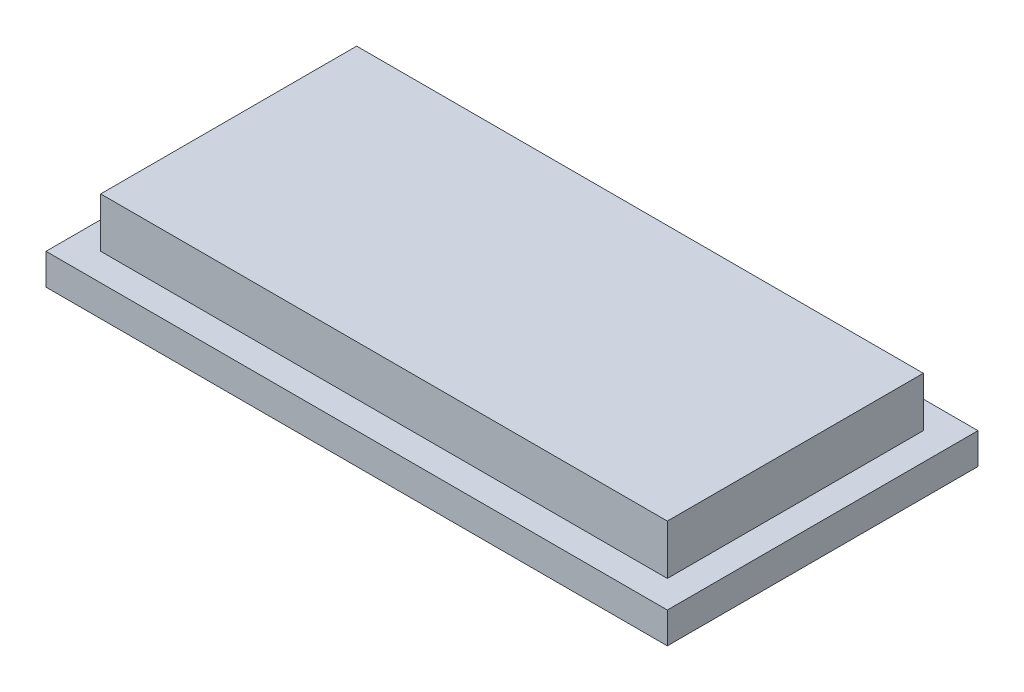
ISO-10303-21;
HEADER;
FILE_DESCRIPTION(('STEP AP214'),'2;1');
FILE_NAME('part.step','',(''),(''),'','','');
FILE_SCHEMA(('AUTOMOTIVE_DESIGN { 1 0 10303 214 1 1 1 1 }'));
ENDSEC;
DATA;
#1=APPLICATION_CONTEXT('core data for automotive mechanical design processes');
#2=APPLICATION_PROTOCOL_DEFINITION('international standard','automotive_design',2000,#1);
#3=PRODUCT_CONTEXT('',#1,'mechanical');
#4=PRODUCT('Part','Part','',(#3));
#5=PRODUCT_RELATED_PRODUCT_CATEGORY('part','',(#4));
#6=PRODUCT_DEFINITION_FORMATION('','',#4);
#7=PRODUCT_DEFINITION_CONTEXT('part definition',#1,'design');
#8=PRODUCT_DEFINITION('design','',#6,#7);
#9=PRODUCT_DEFINITION_SHAPE('','',#8);
#10=(LENGTH_UNIT() NAMED_UNIT(*) SI_UNIT(.MILLI.,.METRE.));
#11=(NAMED_UNIT(*) PLANE_ANGLE_UNIT() SI_UNIT($,.RADIAN.));
#12=(NAMED_UNIT(*) SI_UNIT($,.STERADIAN.) SOLID_ANGLE_UNIT());
#13=UNCERTAINTY_MEASURE_WITH_UNIT(LENGTH_MEASURE(1.E-05),#10,'distance_accuracy_value','');
#14=(GEOMETRIC_REPRESENTATION_CONTEXT(3) GLOBAL_UNCERTAINTY_ASSIGNED_CONTEXT((#13)) GLOBAL_UNIT_ASSIGNED_CONTEXT((#10,
#11,#12)) REPRESENTATION_CONTEXT('',''));
#15=CARTESIAN_POINT('',(0.,0.,0.));
#16=DIRECTION('',(0.,0.,1.));
#17=DIRECTION('',(1.,0.,0.));
#18=AXIS2_PLACEMENT_3D('',#15,#16,#17);
#19=CARTESIAN_POINT('',(0.,2.5,0.));
#20=DIRECTION('',(0.,-1.,0.));
#21=DIRECTION('',(0.,0.,-1.));
#22=AXIS2_PLACEMENT_3D('',#19,#20,#21);
#23=PLANE('',#22);
#24=DIRECTION('',(0.,0.,1.));
#25=VECTOR('',#24,1.);
#26=CARTESIAN_POINT('',(0.,2.5,0.));
#27=LINE('',#26,#25);
#28=CARTESIAN_POINT('',(0.,2.5,-25.));
#29=VERTEX_POINT('',#28);
#30=CARTESIAN_POINT('',(0.,2.5,0.));
#31=VERTEX_POINT('',#30);
#32=EDGE_CURVE('E127',#29,#31,#27,.T.);
#33=ORIENTED_EDGE('',*,*,#32,.T.);
#34=DIRECTION('',(1.,0.,0.));
#35=VECTOR('',#34,1.);
#36=CARTESIAN_POINT('',(0.,2.5,0.));
#37=LINE('',#36,#35);
#38=CARTESIAN_POINT('',(50.,2.5,0.));
#39=VERTEX_POINT('',#38);
#40=EDGE_CURVE('E130',#31,#39,#37,.T.);
#41=ORIENTED_EDGE('',*,*,#40,.T.);
#42=DIRECTION('',(0.,0.,-1.));
#43=VECTOR('',#42,1.);
#44=CARTESIAN_POINT('',(50.,2.5,0.));
#45=LINE('',#44,#43);
#46=CARTESIAN_POINT('',(50.,2.5,-25.));
#47=VERTEX_POINT('',#46);
#48=EDGE_CURVE('E133',#39,#47,#45,.T.);
#49=ORIENTED_EDGE('',*,*,#48,.T.);
#50=DIRECTION('',(-1.,0.,0.));
#51=VECTOR('',#50,1.);
#52=CARTESIAN_POINT('',(0.,2.5,-25.));
#53=LINE('',#52,#51);
#54=EDGE_CURVE('E135',#47,#29,#53,.T.);
#55=ORIENTED_EDGE('',*,*,#54,.T.);
#56=EDGE_LOOP('',(#33,#41,#49,#55));
#57=FACE_BOUND('',#56,.T.);
#58=DIRECTION('',(0.,0.,1.));
#59=VECTOR('',#58,1.);
#60=CARTESIAN_POINT('',(2.19999999999999,2.5,-2.2));
#61=LINE('',#60,#59);
#62=CARTESIAN_POINT('',(2.19999999999999,2.5,-22.8));
#63=VERTEX_POINT('',#62);
#64=CARTESIAN_POINT('',(2.19999999999999,2.5,-2.2));
#65=VERTEX_POINT('',#64);
#66=EDGE_CURVE('E48',#63,#65,#61,.T.);
#67=ORIENTED_EDGE('',*,*,#66,.F.);
#68=DIRECTION('',(-1.,0.,0.));
#69=VECTOR('',#68,1.);
#70=CARTESIAN_POINT('',(2.19999999999999,2.5,-22.8));
#71=LINE('',#70,#69);
#72=CARTESIAN_POINT('',(47.8,2.5,-22.8));
#73=VERTEX_POINT('',#72);
#74=EDGE_CURVE('E52',#73,#63,#71,.T.);
#75=ORIENTED_EDGE('',*,*,#74,.F.);
#76=DIRECTION('',(0.,0.,-1.));
#77=VECTOR('',#76,1.);
#78=CARTESIAN_POINT('',(47.8,2.5,-2.2));
#79=LINE('',#78,#77);
#80=CARTESIAN_POINT('',(47.8,2.5,-2.2));
#81=VERTEX_POINT('',#80);
#82=EDGE_CURVE('E260',#81,#73,#79,.T.);
#83=ORIENTED_EDGE('',*,*,#82,.F.);
#84=DIRECTION('',(1.,0.,0.));
#85=VECTOR('',#84,1.);
#86=CARTESIAN_POINT('',(2.19999999999999,2.5,-2.2));
#87=LINE('',#86,#85);
#88=EDGE_CURVE('E266',#65,#81,#87,.T.);
#89=ORIENTED_EDGE('',*,*,#88,.F.);
#90=EDGE_LOOP('',(#67,#75,#83,#89));
#91=FACE_BOUND('',#90,.T.);
#92=ADVANCED_FACE('F33',(#57,#91),#23,.F.);
#93=CARTESIAN_POINT('',(0.,2.5,0.));
#94=DIRECTION('',(1.,0.,0.));
#95=DIRECTION('',(0.,0.,-1.));
#96=AXIS2_PLACEMENT_3D('',#93,#94,#95);
#97=PLANE('',#96);
#98=DIRECTION('',(0.,0.,1.));
#99=VECTOR('',#98,1.);
#100=CARTESIAN_POINT('',(0.,0.,0.));
#101=LINE('',#100,#99);
#102=CARTESIAN_POINT('',(0.,0.,-25.));
#103=VERTEX_POINT('',#102);
#104=CARTESIAN_POINT('',(0.,0.,0.));
#105=VERTEX_POINT('',#104);
#106=EDGE_CURVE('E118',#103,#105,#101,.T.);
#107=ORIENTED_EDGE('',*,*,#106,.T.);
#108=DIRECTION('',(0.,-1.,0.));
#109=VECTOR('',#108,1.);
#110=CARTESIAN_POINT('',(0.,2.5,0.));
#111=LINE('',#110,#109);
#112=EDGE_CURVE('E11',#31,#105,#111,.T.);
#113=ORIENTED_EDGE('',*,*,#112,.F.);
#114=ORIENTED_EDGE('',*,*,#32,.F.);
#115=DIRECTION('',(0.,-1.,0.));
#116=VECTOR('',#115,1.);
#117=CARTESIAN_POINT('',(0.,2.5,-25.));
#118=LINE('',#117,#116);
#119=EDGE_CURVE('E136',#29,#103,#118,.T.);
#120=ORIENTED_EDGE('',*,*,#119,.T.);
#121=EDGE_LOOP('',(#107,#113,#114,#120));
#122=FACE_BOUND('',#121,.T.);
#123=ADVANCED_FACE('F35',(#122),#97,.F.);
#124=CARTESIAN_POINT('',(0.,2.5,0.));
#125=DIRECTION('',(0.,0.,-1.));
#126=DIRECTION('',(-1.,0.,0.));
#127=AXIS2_PLACEMENT_3D('',#124,#125,#126);
#128=PLANE('',#127);
#129=DIRECTION('',(1.,0.,0.));
#130=VECTOR('',#129,1.);
#131=CARTESIAN_POINT('',(0.,0.,0.));
#132=LINE('',#131,#130);
#133=CARTESIAN_POINT('',(50.,0.,0.));
#134=VERTEX_POINT('',#133);
#135=EDGE_CURVE('E121',#105,#134,#132,.T.);
#136=ORIENTED_EDGE('',*,*,#135,.T.);
#137=DIRECTION('',(0.,-1.,0.));
#138=VECTOR('',#137,1.);
#139=CARTESIAN_POINT('',(50.,2.5,0.));
#140=LINE('',#139,#138);
#141=EDGE_CURVE('E41',#39,#134,#140,.T.);
#142=ORIENTED_EDGE('',*,*,#141,.F.);
#143=ORIENTED_EDGE('',*,*,#40,.F.);
#144=ORIENTED_EDGE('',*,*,#112,.T.);
#145=EDGE_LOOP('',(#136,#142,#143,#144));
#146=FACE_BOUND('',#145,.T.);
#147=ADVANCED_FACE('F166',(#146),#128,.F.);
#148=CARTESIAN_POINT('',(50.,2.5,0.));
#149=DIRECTION('',(-1.,0.,0.));
#150=DIRECTION('',(0.,0.,1.));
#151=AXIS2_PLACEMENT_3D('',#148,#149,#150);
#152=PLANE('',#151);
#153=DIRECTION('',(0.,0.,-1.));
#154=VECTOR('',#153,1.);
#155=CARTESIAN_POINT('',(50.,0.,0.));
#156=LINE('',#155,#154);
#157=CARTESIAN_POINT('',(50.,0.,-25.));
#158=VERTEX_POINT('',#157);
#159=EDGE_CURVE('E139',#134,#158,#156,.T.);
#160=ORIENTED_EDGE('',*,*,#159,.T.);
#161=DIRECTION('',(0.,-1.,0.));
#162=VECTOR('',#161,1.);
#163=CARTESIAN_POINT('',(50.,2.5,-25.));
#164=LINE('',#163,#162);
#165=EDGE_CURVE('E144',#47,#158,#164,.T.);
#166=ORIENTED_EDGE('',*,*,#165,.F.);
#167=ORIENTED_EDGE('',*,*,#48,.F.);
#168=ORIENTED_EDGE('',*,*,#141,.T.);
#169=EDGE_LOOP('',(#160,#166,#167,#168));
#170=FACE_BOUND('',#169,.T.);
#171=ADVANCED_FACE('F151',(#170),#152,.F.);
#172=CARTESIAN_POINT('',(0.,2.5,-25.));
#173=DIRECTION('',(0.,0.,1.));
#174=DIRECTION('',(1.,0.,0.));
#175=AXIS2_PLACEMENT_3D('',#172,#173,#174);
#176=PLANE('',#175);
#177=DIRECTION('',(-1.,0.,0.));
#178=VECTOR('',#177,1.);
#179=CARTESIAN_POINT('',(0.,0.,-25.));
#180=LINE('',#179,#178);
#181=EDGE_CURVE('E131',#158,#103,#180,.T.);
#182=ORIENTED_EDGE('',*,*,#181,.T.);
#183=ORIENTED_EDGE('',*,*,#119,.F.);
#184=ORIENTED_EDGE('',*,*,#54,.F.);
#185=ORIENTED_EDGE('',*,*,#165,.T.);
#186=EDGE_LOOP('',(#182,#183,#184,#185));
#187=FACE_BOUND('',#186,.T.);
#188=ADVANCED_FACE('F160',(#187),#176,.F.);
#189=CARTESIAN_POINT('',(0.,0.,0.));
#190=DIRECTION('',(0.,-1.,0.));
#191=DIRECTION('',(0.,0.,-1.));
#192=AXIS2_PLACEMENT_3D('',#189,#190,#191);
#193=PLANE('',#192);
#194=ORIENTED_EDGE('',*,*,#106,.F.);
#195=ORIENTED_EDGE('',*,*,#181,.F.);
#196=ORIENTED_EDGE('',*,*,#159,.F.);
#197=ORIENTED_EDGE('',*,*,#135,.F.);
#198=EDGE_LOOP('',(#194,#195,#196,#197));
#199=FACE_BOUND('',#198,.T.);
#200=ADVANCED_FACE('F157',(#199),#193,.T.);
#201=CARTESIAN_POINT('',(2.19999999999999,6.5,-2.2));
#202=DIRECTION('',(1.,0.,0.));
#203=DIRECTION('',(0.,0.,-1.));
#204=AXIS2_PLACEMENT_3D('',#201,#202,#203);
#205=PLANE('',#204);
#206=ORIENTED_EDGE('',*,*,#66,.T.);
#207=DIRECTION('',(0.,-1.,0.));
#208=VECTOR('',#207,1.);
#209=CARTESIAN_POINT('',(2.19999999999999,6.5,-2.2));
#210=LINE('',#209,#208);
#211=CARTESIAN_POINT('',(2.19999999999999,6.5,-2.2));
#212=VERTEX_POINT('',#211);
#213=EDGE_CURVE('E101',#212,#65,#210,.T.);
#214=ORIENTED_EDGE('',*,*,#213,.F.);
#215=DIRECTION('',(0.,0.,1.));
#216=VECTOR('',#215,1.);
#217=CARTESIAN_POINT('',(2.19999999999999,6.5,-2.2));
#218=LINE('',#217,#216);
#219=CARTESIAN_POINT('',(2.19999999999999,6.5,-22.8));
#220=VERTEX_POINT('',#219);
#221=EDGE_CURVE('E107',#220,#212,#218,.T.);
#222=ORIENTED_EDGE('',*,*,#221,.F.);
#223=DIRECTION('',(0.,-1.,0.));
#224=VECTOR('',#223,1.);
#225=CARTESIAN_POINT('',(2.19999999999999,6.5,-22.8));
#226=LINE('',#225,#224);
#227=EDGE_CURVE('E258',#220,#63,#226,.T.);
#228=ORIENTED_EDGE('',*,*,#227,.T.);
#229=EDGE_LOOP('',(#206,#214,#222,#228));
#230=FACE_BOUND('',#229,.T.);
#231=ADVANCED_FACE('F117',(#230),#205,.F.);
#232=CARTESIAN_POINT('',(2.19999999999999,6.5,-2.2));
#233=DIRECTION('',(0.,0.,-1.));
#234=DIRECTION('',(-1.,0.,0.));
#235=AXIS2_PLACEMENT_3D('',#232,#233,#234);
#236=PLANE('',#235);
#237=ORIENTED_EDGE('',*,*,#88,.T.);
#238=DIRECTION('',(0.,-1.,0.));
#239=VECTOR('',#238,1.);
#240=CARTESIAN_POINT('',(47.8,6.5,-2.2));
#241=LINE('',#240,#239);
#242=CARTESIAN_POINT('',(47.8,6.5,-2.2));
#243=VERTEX_POINT('',#242);
#244=EDGE_CURVE('E103',#243,#81,#241,.T.);
#245=ORIENTED_EDGE('',*,*,#244,.F.);
#246=DIRECTION('',(1.,0.,0.));
#247=VECTOR('',#246,1.);
#248=CARTESIAN_POINT('',(2.19999999999999,6.5,-2.2));
#249=LINE('',#248,#247);
#250=EDGE_CURVE('E96',#212,#243,#249,.T.);
#251=ORIENTED_EDGE('',*,*,#250,.F.);
#252=ORIENTED_EDGE('',*,*,#213,.T.);
#253=EDGE_LOOP('',(#237,#245,#251,#252));
#254=FACE_BOUND('',#253,.T.);
#255=ADVANCED_FACE('F99',(#254),#236,.F.);
#256=CARTESIAN_POINT('',(47.8,6.5,-2.2));
#257=DIRECTION('',(-1.,0.,0.));
#258=DIRECTION('',(0.,0.,1.));
#259=AXIS2_PLACEMENT_3D('',#256,#257,#258);
#260=PLANE('',#259);
#261=ORIENTED_EDGE('',*,*,#82,.T.);
#262=DIRECTION('',(0.,-1.,0.));
#263=VECTOR('',#262,1.);
#264=CARTESIAN_POINT('',(47.8,6.5,-22.8));
#265=LINE('',#264,#263);
#266=CARTESIAN_POINT('',(47.8,6.5,-22.8));
#267=VERTEX_POINT('',#266);
#268=EDGE_CURVE('E123',#267,#73,#265,.T.);
#269=ORIENTED_EDGE('',*,*,#268,.F.);
#270=DIRECTION('',(0.,0.,-1.));
#271=VECTOR('',#270,1.);
#272=CARTESIAN_POINT('',(47.8,6.5,-2.2));
#273=LINE('',#272,#271);
#274=EDGE_CURVE('E106',#243,#267,#273,.T.);
#275=ORIENTED_EDGE('',*,*,#274,.F.);
#276=ORIENTED_EDGE('',*,*,#244,.T.);
#277=EDGE_LOOP('',(#261,#269,#275,#276));
#278=FACE_BOUND('',#277,.T.);
#279=ADVANCED_FACE('F202',(#278),#260,.F.);
#280=CARTESIAN_POINT('',(2.19999999999999,6.5,-22.8));
#281=DIRECTION('',(0.,0.,1.));
#282=DIRECTION('',(1.,0.,0.));
#283=AXIS2_PLACEMENT_3D('',#280,#281,#282);
#284=PLANE('',#283);
#285=ORIENTED_EDGE('',*,*,#74,.T.);
#286=ORIENTED_EDGE('',*,*,#227,.F.);
#287=DIRECTION('',(-1.,0.,0.));
#288=VECTOR('',#287,1.);
#289=CARTESIAN_POINT('',(2.19999999999999,6.5,-22.8));
#290=LINE('',#289,#288);
#291=EDGE_CURVE('E112',#267,#220,#290,.T.);
#292=ORIENTED_EDGE('',*,*,#291,.F.);
#293=ORIENTED_EDGE('',*,*,#268,.T.);
#294=EDGE_LOOP('',(#285,#286,#292,#293));
#295=FACE_BOUND('',#294,.T.);
#296=ADVANCED_FACE('F208',(#295),#284,.F.);
#297=CARTESIAN_POINT('',(0.,6.5,0.));
#298=DIRECTION('',(0.,-1.,0.));
#299=DIRECTION('',(0.,0.,-1.));
#300=AXIS2_PLACEMENT_3D('',#297,#298,#299);
#301=PLANE('',#300);
#302=ORIENTED_EDGE('',*,*,#221,.T.);
#303=ORIENTED_EDGE('',*,*,#250,.T.);
#304=ORIENTED_EDGE('',*,*,#274,.T.);
#305=ORIENTED_EDGE('',*,*,#291,.T.);
#306=EDGE_LOOP('',(#302,#303,#304,#305));
#307=FACE_BOUND('',#306,.T.);
#308=ADVANCED_FACE('F110',(#307),#301,.F.);
#309=CLOSED_SHELL('',(#92,#123,#147,#171,#188,#200,#231,#255,#279,#296,#308));
#310=MANIFOLD_SOLID_BREP('B2',#309);
#311=ADVANCED_BREP_SHAPE_REPRESENTATION('',(#18,#310),#14);
#312=SHAPE_DEFINITION_REPRESENTATION(#9,#311);
ENDSEC;
END-ISO-10303-21;
